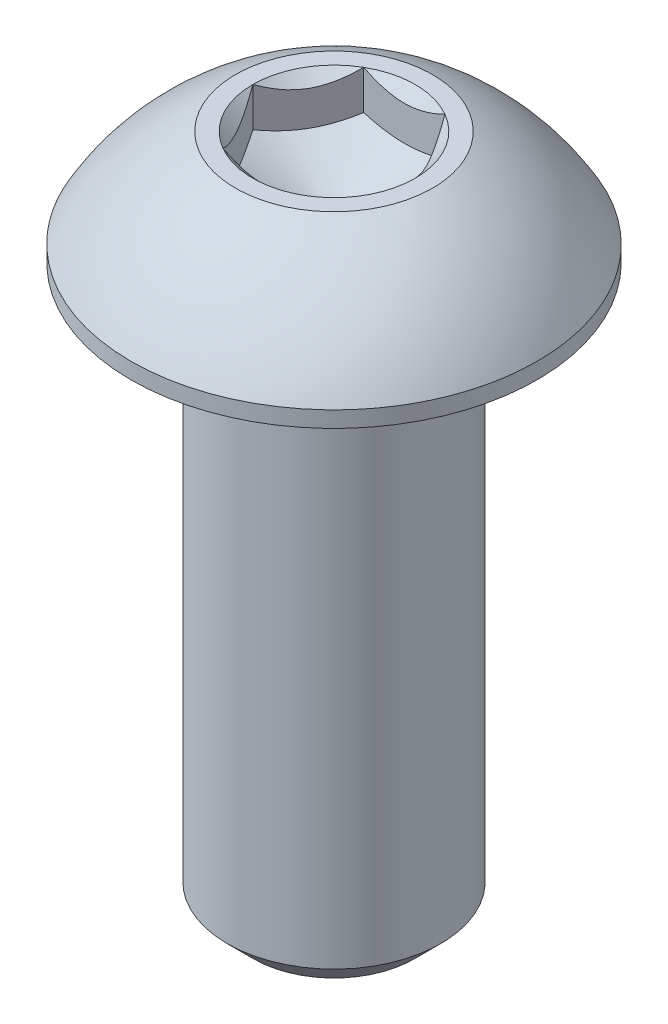
ISO-10303-21;
HEADER;
FILE_DESCRIPTION(('STEP AP214'),'2;1');
FILE_NAME('part.step','',(''),(''),'','','');
FILE_SCHEMA(('AUTOMOTIVE_DESIGN { 1 0 10303 214 1 1 1 1 }'));
ENDSEC;
DATA;
#1=APPLICATION_CONTEXT('core data for automotive mechanical design processes');
#2=APPLICATION_PROTOCOL_DEFINITION('international standard','automotive_design',2000,#1);
#3=PRODUCT_CONTEXT('',#1,'mechanical');
#4=PRODUCT('Part','Part','',(#3));
#5=PRODUCT_RELATED_PRODUCT_CATEGORY('part','',(#4));
#6=PRODUCT_DEFINITION_FORMATION('','',#4);
#7=PRODUCT_DEFINITION_CONTEXT('part definition',#1,'design');
#8=PRODUCT_DEFINITION('design','',#6,#7);
#9=PRODUCT_DEFINITION_SHAPE('','',#8);
#10=(LENGTH_UNIT() NAMED_UNIT(*) SI_UNIT(.MILLI.,.METRE.));
#11=(NAMED_UNIT(*) PLANE_ANGLE_UNIT() SI_UNIT($,.RADIAN.));
#12=(NAMED_UNIT(*) SI_UNIT($,.STERADIAN.) SOLID_ANGLE_UNIT());
#13=UNCERTAINTY_MEASURE_WITH_UNIT(LENGTH_MEASURE(1.E-05),#10,'distance_accuracy_value','');
#14=(GEOMETRIC_REPRESENTATION_CONTEXT(3) GLOBAL_UNCERTAINTY_ASSIGNED_CONTEXT((#13)) GLOBAL_UNIT_ASSIGNED_CONTEXT((#10,
#11,#12)) REPRESENTATION_CONTEXT('',''));
#15=CARTESIAN_POINT('',(0.,0.,0.));
#16=DIRECTION('',(0.,0.,1.));
#17=DIRECTION('',(1.,0.,0.));
#18=AXIS2_PLACEMENT_3D('',#15,#16,#17);
#19=CARTESIAN_POINT('',(0.,1.68698333328621,0.));
#20=DIRECTION('',(0.,1.,0.));
#21=DIRECTION('',(-1.,0.,0.));
#22=AXIS2_PLACEMENT_3D('',#19,#20,#21);
#23=CONICAL_SURFACE('',#22,1.84408562728322,1.04719755120045);
#24=CARTESIAN_POINT('',(0.,0.622299999974985,0.));
#25=VERTEX_POINT('',#24);
#26=VERTEX_LOOP('',#25);
#27=FACE_BOUND('',#26,.T.);
#28=CARTESIAN_POINT('',(1.83308710468165,1.68063333330156,7.94276010632228E-12));
#29=CARTESIAN_POINT('',(1.79281056633891,1.65737292224276,-0.0697610107546779));
#30=CARTESIAN_POINT('',(1.75218636149017,1.63621879574418,-0.140124197569787));
#31=CARTESIAN_POINT('',(1.67023457085926,1.59929490329089,-0.282068862713764));
#32=CARTESIAN_POINT('',(1.62890552942637,1.58353819818402,-0.353652862303655));
#33=CARTESIAN_POINT('',(1.54675961666491,1.55901175070747,-0.495933756840625));
#34=CARTESIAN_POINT('',(1.50595538099753,1.55007875220177,-0.566608766180528));
#35=CARTESIAN_POINT('',(1.42415501242217,1.53941661050333,-0.708291160630917));
#36=CARTESIAN_POINT('',(1.38315917663227,1.53767863601706,-0.779298031117773));
#37=CARTESIAN_POINT('',(1.30656285397213,1.5413034511771,-0.911966753638082));
#38=CARTESIAN_POINT('',(1.27095087320288,1.54577622879446,-0.973648513688575));
#39=CARTESIAN_POINT('',(1.19995891211689,1.55994944206934,-1.09661019721847));
#40=CARTESIAN_POINT('',(1.16457917715915,1.56965471453079,-1.15788969572359));
#41=CARTESIAN_POINT('',(1.09344096593547,1.59391601722574,-1.28110469192258));
#42=CARTESIAN_POINT('',(1.05769148862926,1.60857484155799,-1.34302460296097));
#43=CARTESIAN_POINT('',(0.986725583285904,1.64184417550588,-1.46594115662078));
#44=CARTESIAN_POINT('',(0.951508246794672,1.660446873169,-1.52693937273084));
#45=CARTESIAN_POINT('',(0.91654353567499,1.68063334291961,-1.5875000288621));
#46=B_SPLINE_CURVE_WITH_KNOTS('',3,(#28,#29,#30,#31,#32,#33,#34,#35,#36,#37,#38,#39,#40,#41,#42,
#43,#44,#45),.UNSPECIFIED.,.F.,.F.,(4,2,2,2,2,2,2,2,4),(0.,0.25163145920722,0.503867592337533,
0.749861662422156,0.995553705563786,1.20944306090894,1.42353047074415,1.64236531368521,
1.86077067615945),.UNSPECIFIED.);
#47=CARTESIAN_POINT('',(1.83308710467935,1.68063333330023,-3.97200432340522E-12));
#48=VERTEX_POINT('',#47);
#49=CARTESIAN_POINT('',(0.916543500689181,1.68063332560455,-1.58750001443105));
#50=VERTEX_POINT('',#49);
#51=EDGE_CURVE('E111',#48,#50,#46,.T.);
#52=ORIENTED_EDGE('',*,*,#51,.T.);
#53=CARTESIAN_POINT('',(0.916543465703373,1.68063330828949,-1.5875));
#54=CARTESIAN_POINT('',(0.841304335442012,1.65891136904666,-1.58749999999996));
#55=CARTESIAN_POINT('',(0.765469996919557,1.63902432100938,-1.58749999999998));
#56=CARTESIAN_POINT('',(0.612569443736088,1.60387643134396,-1.58750000000002));
#57=CARTESIAN_POINT('',(0.53550087134523,1.58862594056695,-1.58750000000004));
#58=CARTESIAN_POINT('',(0.382228504812052,1.56410130515335,-1.58749999999996));
#59=CARTESIAN_POINT('',(0.30604629018988,1.55469640544159,-1.58749999999987));
#60=CARTESIAN_POINT('',(0.153242338423504,1.54207088542383,-1.58750000000013));
#61=CARTESIAN_POINT('',(0.0766211692133859,1.53884355230366,-1.58750000000049));
#62=CARTESIAN_POINT('',(-0.0766211765422199,1.53884355230651,-1.58750000000049));
#63=CARTESIAN_POINT('',(-0.153242353087707,1.54207088604693,-1.58750000000013));
#64=CARTESIAN_POINT('',(-0.306046319402563,1.55469640844525,-1.58749999999987));
#65=CARTESIAN_POINT('',(-0.382228541237543,1.56410130992023,-1.58749999999996));
#66=CARTESIAN_POINT('',(-0.535500922320663,1.588625949812,-1.58750000000004));
#67=CARTESIAN_POINT('',(-0.612569502041049,1.60387644333815,-1.58750000000002));
#68=CARTESIAN_POINT('',(-0.765470069592637,1.63902433912291,-1.58749999999998));
#69=CARTESIAN_POINT('',(-0.841304415154823,1.65891139052621,-1.58749999999996));
#70=CARTESIAN_POINT('',(-0.916543552347703,1.68063333330156,-1.5875));
#71=B_SPLINE_CURVE_WITH_KNOTS('',3,(#53,#54,#55,#56,#57,#58,#59,#60,#61,#62,#63,#64,#65,#66,#67,
#68,#69,#70),.UNSPECIFIED.,.F.,.F.,(4,2,2,2,2,2,2,2,4),(0.,0.235008234984496,0.470537323953047,
0.700588176227614,0.93038890294962,1.16018965165212,1.39024052599311,1.62576963810153,
1.86077789603511),.UNSPECIFIED.);
#72=CARTESIAN_POINT('',(-0.916543552343117,1.68063333330023,-1.5875));
#73=VERTEX_POINT('',#72);
#74=EDGE_CURVE('E107',#50,#73,#71,.T.);
#75=ORIENTED_EDGE('',*,*,#74,.T.);
#76=CARTESIAN_POINT('',(-0.916543552333945,1.68063333330156,-1.58750000000794));
#77=CARTESIAN_POINT('',(-0.956820090671271,1.65737292224584,-1.5177389892547));
#78=CARTESIAN_POINT('',(-0.997444295514534,1.63621879574984,-1.44737580244908));
#79=CARTESIAN_POINT('',(-1.07939608613362,1.59929490330038,-1.30543113732557));
#80=CARTESIAN_POINT('',(-1.12072512756017,1.58353819819468,-1.23384713774668));
#81=CARTESIAN_POINT('',(-1.20287104032067,1.5590117507145,-1.09156624321137));
#82=CARTESIAN_POINT('',(-1.24367527599358,1.55007875220591,-1.02089123386187));
#83=CARTESIAN_POINT('',(-1.32547564458103,1.539416610504,-0.879208839390551));
#84=CARTESIAN_POINT('',(-1.36647148037747,1.53767863601724,-0.808201968892358));
#85=CARTESIAN_POINT('',(-1.44306780163656,1.54130345111013,-0.675533248798745));
#86=CARTESIAN_POINT('',(-1.47867978100122,1.54577622844007,-0.613851491181058));
#87=CARTESIAN_POINT('',(-1.5496717393014,1.55994944074467,-0.490889812476353));
#88=CARTESIAN_POINT('',(-1.58505147287795,1.56965471252234,-0.429610316363514));
#89=CARTESIAN_POINT('',(-1.65618968130729,1.59391601351232,-0.306395325004476));
#90=CARTESIAN_POINT('',(-1.69193915720172,1.60857483681103,-0.244475416411364));
#91=CARTESIAN_POINT('',(-1.76290505977286,1.64184416846707,-0.121558867553154));
#92=CARTESIAN_POINT('',(-1.79812239490349,1.66044686487324,-0.0605606537997263));
#93=CARTESIAN_POINT('',(-1.83308710468165,1.68063333330156,7.94280702249205E-12));
#94=B_SPLINE_CURVE_WITH_KNOTS('',3,(#76,#77,#78,#79,#80,#81,#82,#83,#84,#85,#86,#87,#88,#89,#90,
#91,#92,#93),.UNSPECIFIED.,.F.,.F.,(4,2,2,2,2,2,2,2,4),(0.,0.25163145917351,0.503867592265784,
0.749861662384702,0.995553705563769,1.20944305246948,1.42353045383403,1.64236528786455,
1.8607706414961),.UNSPECIFIED.);
#95=CARTESIAN_POINT('',(-1.83308710467935,1.68063333330023,3.97168329557327E-12));
#96=VERTEX_POINT('',#95);
#97=EDGE_CURVE('E88',#73,#96,#94,.T.);
#98=ORIENTED_EDGE('',*,*,#97,.T.);
#99=CARTESIAN_POINT('',(-1.83308710468165,1.68063333330156,-7.94272365368566E-12));
#100=CARTESIAN_POINT('',(-1.79281056634432,1.65737292224584,0.0697610107453017));
#101=CARTESIAN_POINT('',(-1.75218636150106,1.63621879574984,0.140124197550919));
#102=CARTESIAN_POINT('',(-1.67023457088197,1.59929490330038,0.282068862674426));
#103=CARTESIAN_POINT('',(-1.62890552945543,1.58353819819468,0.353652862253321));
#104=CARTESIAN_POINT('',(-1.54675961669492,1.5590117507145,0.495933756788634));
#105=CARTESIAN_POINT('',(-1.50595538102201,1.55007875220591,0.566608766138132));
#106=CARTESIAN_POINT('',(-1.42415501243456,1.539416610504,0.708291160609449));
#107=CARTESIAN_POINT('',(-1.38315917663812,1.53767863601724,0.779298031107642));
#108=CARTESIAN_POINT('',(-1.30656285537903,1.54130345111013,0.911966751201255));
#109=CARTESIAN_POINT('',(-1.27095087601437,1.54577622844007,0.973648508818941));
#110=CARTESIAN_POINT('',(-1.1999589177142,1.55994944074467,1.09661018752365));
#111=CARTESIAN_POINT('',(-1.16457918413765,1.56965471252234,1.15788968363649));
#112=CARTESIAN_POINT('',(-1.09344097570831,1.59391601351232,1.28110467499552));
#113=CARTESIAN_POINT('',(-1.05769149981388,1.60857483681103,1.34302458358864));
#114=CARTESIAN_POINT('',(-0.986725597242731,1.64184416846707,1.46594113244685));
#115=CARTESIAN_POINT('',(-0.951508262112103,1.66044686487324,1.52693934620027));
#116=CARTESIAN_POINT('',(-0.916543552333946,1.68063333330156,1.58750000000794));
#117=B_SPLINE_CURVE_WITH_KNOTS('',3,(#99,#100,#101,#102,#103,#104,#105,#106,#107,#108,#109,#110,
#111,#112,#113,#114,#115,#116),.UNSPECIFIED.,.F.,.F.,(4,2,2,2,2,2,2,2,4),(0.,0.25163145917351,
0.503867592265784,0.749861662384702,0.995553705563769,1.20944305246948,1.42353045383403,
1.64236528786455,1.8607706414961),.UNSPECIFIED.);
#118=CARTESIAN_POINT('',(-0.916543552340825,1.68063333330156,1.58750000000397));
#119=VERTEX_POINT('',#118);
#120=EDGE_CURVE('E85',#96,#119,#117,.T.);
#121=ORIENTED_EDGE('',*,*,#120,.T.);
#122=CARTESIAN_POINT('',(-0.916543552347703,1.68063333330156,1.5875));
#123=CARTESIAN_POINT('',(-0.841304415129728,1.658911390519,1.58750000000013));
#124=CARTESIAN_POINT('',(-0.765470069542191,1.6390243391097,1.58750000000006));
#125=CARTESIAN_POINT('',(-0.612569501934773,1.60387644331534,1.58749999999993));
#126=CARTESIAN_POINT('',(-0.535500922183844,1.58862594978587,1.58749999999987));
#127=CARTESIAN_POINT('',(-0.382228541095324,1.56410130990161,1.58750000000013));
#128=CARTESIAN_POINT('',(-0.306046319286171,1.55469640843333,1.58750000000044));
#129=CARTESIAN_POINT('',(-0.153242353028406,1.54207088604434,1.58749999999956));
#130=CARTESIAN_POINT('',(-0.0766211765142031,1.5388435523063,1.58749999999838));
#131=CARTESIAN_POINT('',(0.0766211765142028,1.5388435523063,1.58749999999838));
#132=CARTESIAN_POINT('',(0.153242353028406,1.54207088604434,1.58749999999956));
#133=CARTESIAN_POINT('',(0.30604631928617,1.55469640843333,1.58750000000044));
#134=CARTESIAN_POINT('',(0.382228541095323,1.56410130990161,1.58750000000013));
#135=CARTESIAN_POINT('',(0.535500922183843,1.58862594978587,1.58749999999987));
#136=CARTESIAN_POINT('',(0.612569501934772,1.60387644331534,1.58749999999993));
#137=CARTESIAN_POINT('',(0.76547006954219,1.6390243391097,1.58750000000006));
#138=CARTESIAN_POINT('',(0.841304415129726,1.658911390519,1.58750000000013));
#139=CARTESIAN_POINT('',(0.916543552347702,1.68063333330156,1.5875));
#140=B_SPLINE_CURVE_WITH_KNOTS('',3,(#122,#123,#124,#125,#126,#127,#128,#129,#130,#131,#132,
#133,#134,#135,#136,#137,#138,#139),.UNSPECIFIED.,.F.,.F.,(4,2,2,2,2,2,2,2,4),(0.,
0.235008258011669,0.470537370211884,0.700588244472678,0.930388993085473,1.16018974169827,
1.39024061595906,1.62576972815928,1.86077798617094),.UNSPECIFIED.);
#141=CARTESIAN_POINT('',(0.916543552343116,1.68063333330023,1.5875));
#142=VERTEX_POINT('',#141);
#143=EDGE_CURVE('E20',#119,#142,#140,.T.);
#144=ORIENTED_EDGE('',*,*,#143,.T.);
#145=CARTESIAN_POINT('',(0.916543552333945,1.68063333330156,1.58750000000794));
#146=CARTESIAN_POINT('',(0.956820090671271,1.65737292224584,1.5177389892547));
#147=CARTESIAN_POINT('',(0.997444295514534,1.63621879574984,1.44737580244908));
#148=CARTESIAN_POINT('',(1.07939608613362,1.59929490330038,1.30543113732557));
#149=CARTESIAN_POINT('',(1.12072512756017,1.58353819819468,1.23384713774668));
#150=CARTESIAN_POINT('',(1.20287104032067,1.5590117507145,1.09156624321137));
#151=CARTESIAN_POINT('',(1.24367527599358,1.55007875220591,1.02089123386187));
#152=CARTESIAN_POINT('',(1.32547564458103,1.539416610504,0.879208839390551));
#153=CARTESIAN_POINT('',(1.36647148037747,1.53767863601724,0.808201968892358));
#154=CARTESIAN_POINT('',(1.44306780163656,1.54130345111013,0.675533248798746));
#155=CARTESIAN_POINT('',(1.47867978100122,1.54577622844007,0.613851491181059));
#156=CARTESIAN_POINT('',(1.54967173930139,1.55994944074467,0.490889812476353));
#157=CARTESIAN_POINT('',(1.58505147287795,1.56965471252234,0.429610316363515));
#158=CARTESIAN_POINT('',(1.65618968130728,1.59391601351232,0.306395325004476));
#159=CARTESIAN_POINT('',(1.69193915720172,1.60857483681103,0.244475416411364));
#160=CARTESIAN_POINT('',(1.76290505977286,1.64184416846707,0.121558867553154));
#161=CARTESIAN_POINT('',(1.79812239490349,1.66044686487324,0.0605606537997262));
#162=CARTESIAN_POINT('',(1.83308710468165,1.68063333330156,-7.94295499227587E-12));
#163=B_SPLINE_CURVE_WITH_KNOTS('',3,(#145,#146,#147,#148,#149,#150,#151,#152,#153,#154,#155,
#156,#157,#158,#159,#160,#161,#162),.UNSPECIFIED.,.F.,.F.,(4,2,2,2,2,2,2,2,4),(0.,
0.25163145917351,0.503867592265784,0.749861662384701,0.995553705563769,1.20944305246948,
1.42353045383403,1.64236528786455,1.8607706414961),.UNSPECIFIED.);
#164=EDGE_CURVE('E83',#142,#48,#163,.T.);
#165=ORIENTED_EDGE('',*,*,#164,.T.);
#166=EDGE_LOOP('',(#52,#75,#98,#121,#144,#165));
#167=FACE_BOUND('',#166,.T.);
#168=ADVANCED_FACE('F16',(#27,#167),#23,.F.);
#169=CARTESIAN_POINT('',(2.2225,-12.701,1.5875));
#170=DIRECTION('',(0.,0.,1.));
#171=DIRECTION('',(1.,0.,0.));
#172=AXIS2_PLACEMENT_3D('',#169,#170,#171);
#173=PLANE('',#172);
#174=DIRECTION('',(0.,1.,0.));
#175=VECTOR('',#174,1.);
#176=CARTESIAN_POINT('',(-0.916543552338532,-12.701,1.5875));
#177=LINE('',#176,#175);
#178=CARTESIAN_POINT('',(-0.916543552351339,2.56539999995478,1.58750000002218));
#179=VERTEX_POINT('',#178);
#180=EDGE_CURVE('E77',#119,#179,#177,.T.);
#181=ORIENTED_EDGE('',*,*,#180,.T.);
#182=CARTESIAN_POINT('',(-0.916543552371599,2.56539999994792,1.58749999999595));
#183=CARTESIAN_POINT('',(-0.853951042769138,2.53413294688092,1.58749999999871));
#184=CARTESIAN_POINT('',(-0.790318655200357,2.50469158145599,1.58749999999969));
#185=CARTESIAN_POINT('',(-0.660541633671972,2.4507249639758,1.58750000000031));
#186=CARTESIAN_POINT('',(-0.594383506081024,2.42623244845778,1.58749999999993));
#187=CARTESIAN_POINT('',(-0.46015516772024,2.38393913822606,1.58750000000006));
#188=CARTESIAN_POINT('',(-0.392092287378396,2.36611569660322,1.58750000000057));
#189=CARTESIAN_POINT('',(-0.254474473006279,2.33867573772343,1.58749999999944));
#190=CARTESIAN_POINT('',(-0.18492484409195,2.32903384177503,1.58749999999781));
#191=CARTESIAN_POINT('',(-0.0959348173078032,2.32259288204442,1.5875000000006));
#192=CARTESIAN_POINT('',(-0.0767574755229647,2.32155158039156,1.58750000000149));
#193=CARTESIAN_POINT('',(-0.0383876515925966,2.32016146096835,1.58749999999851));
#194=CARTESIAN_POINT('',(-0.019195183346946,2.31981226702045,1.58749999999465));
#195=CARTESIAN_POINT('',(0.0481761373889916,2.31981447200048,1.58749999998834));
#196=CARTESIAN_POINT('',(0.0963693775090954,2.3220196183287,1.58749999999681));
#197=CARTESIAN_POINT('',(0.192379976760513,2.33070924092509,1.5875000000032));
#198=CARTESIAN_POINT('',(0.240197050167982,2.33719670192335,1.58750000000111));
#199=CARTESIAN_POINT('',(0.383011002180955,2.36267698349897,1.58749999999777));
#200=CARTESIAN_POINT('',(0.476967063072048,2.38768338081294,1.58749999999948));
#201=CARTESIAN_POINT('',(0.628737189879038,2.4388400286602,1.58750000000034));
#202=CARTESIAN_POINT('',(0.687787687838377,2.46158766208048,1.58750000000017));
#203=CARTESIAN_POINT('',(0.803652764135095,2.51088912316105,1.58749999999983));
#204=CARTESIAN_POINT('',(0.860482853254814,2.53740623437023,1.58749999999967));
#205=CARTESIAN_POINT('',(0.916543552372238,2.56539999994602,1.5875));
#206=B_SPLINE_CURVE_WITH_KNOTS('',3,(#182,#183,#184,#185,#186,#187,#188,#189,#190,#191,#192,
#193,#194,#195,#196,#197,#198,#199,#200,#201,#202,#203,#204,#205),.UNSPECIFIED.,.F.,.F.,(4,2,2,
2,2,2,2,2,2,2,2,4),(0.,0.210047204145353,0.421441388628532,0.63211105945904,0.842124830805997,
0.899732953428039,0.957309756023073,1.10181621381984,1.2464234976589,1.53683268065851,
1.72655304073689,1.91453812068994),.UNSPECIFIED.);
#207=CARTESIAN_POINT('',(0.916543552329892,2.56539999996327,1.58750000004437));
#208=VERTEX_POINT('',#207);
#209=EDGE_CURVE('E98',#179,#208,#206,.T.);
#210=ORIENTED_EDGE('',*,*,#209,.T.);
#211=DIRECTION('',(0.,1.,0.));
#212=VECTOR('',#211,1.);
#213=CARTESIAN_POINT('',(0.91654355233853,-12.701,1.5875));
#214=LINE('',#213,#212);
#215=EDGE_CURVE('E80',#208,#142,#214,.F.);
#216=ORIENTED_EDGE('',*,*,#215,.T.);
#217=ORIENTED_EDGE('',*,*,#143,.F.);
#218=EDGE_LOOP('',(#181,#210,#216,#217));
#219=FACE_BOUND('',#218,.T.);
#220=ADVANCED_FACE('F75',(#219),#173,.F.);
#221=CARTESIAN_POINT('',(1.9304403285078,-12.701,-0.168620729955457));
#222=DIRECTION('',(0.866025403784438,0.,0.500000000000001));
#223=DIRECTION('',(0.500000000000001,0.,-0.866025403784438));
#224=AXIS2_PLACEMENT_3D('',#221,#222,#223);
#225=PLANE('',#224);
#226=CARTESIAN_POINT('',(0.916543552318486,2.56539999994792,1.58750000002661));
#227=CARTESIAN_POINT('',(0.948045601819501,2.53392818230274,1.53293684975349));
#228=CARTESIAN_POINT('',(0.980074366265609,2.50430506272304,1.47746140243131));
#229=CARTESIAN_POINT('',(1.04538430383377,2.45006639539546,1.36434127232568));
#230=CARTESIAN_POINT('',(1.07867168454047,2.42548101616301,1.30668583769021));
#231=CARTESIAN_POINT('',(1.14579405489387,2.38336609605498,1.19042648191324));
#232=CARTESIAN_POINT('',(1.17961195971128,2.36573072948727,1.13185215256412));
#233=CARTESIAN_POINT('',(1.24799206394659,2.33856008862283,1.0134143378018));
#234=CARTESIAN_POINT('',(1.28255217595178,2.32900454007232,0.953554467893514));
#235=CARTESIAN_POINT('',(1.34211812032325,2.32038274183861,0.850383225841286));
#236=CARTESIAN_POINT('',(1.36704705311503,2.31910682172834,0.807205047667461));
#237=CARTESIAN_POINT('',(1.41686413306601,2.32125913780747,0.720919334107648));
#238=CARTESIAN_POINT('',(1.44175226286874,2.32468902284558,0.677811828783944));
#239=CARTESIAN_POINT('',(1.4912872005843,2.33605631415955,0.592014799910837));
#240=CARTESIAN_POINT('',(1.51593378092209,2.34399762019379,0.549325670532947));
#241=CARTESIAN_POINT('',(1.56481324859064,2.36395627681975,0.464663949084111));
#242=CARTESIAN_POINT('',(1.58904595372821,2.37597537628452,0.422691672580996));
#243=CARTESIAN_POINT('',(1.65109202753264,2.41164383188021,0.315224720341557));
#244=CARTESIAN_POINT('',(1.68852122777912,2.43797770752904,0.250395443827986));
#245=CARTESIAN_POINT('',(1.74355675432914,2.48243061453382,0.155071115622044));
#246=CARTESIAN_POINT('',(1.76169266898351,2.49804835924841,0.12365878999894));
#247=CARTESIAN_POINT('',(1.79763114850234,2.53070945052044,0.0614115175255607));
#248=CARTESIAN_POINT('',(1.81543386710544,2.54775211871956,0.0305763043921381));
#249=CARTESIAN_POINT('',(1.83308710469388,2.56539999994598,-2.91208576452051E-11));
#250=B_SPLINE_CURVE_WITH_KNOTS('',3,(#226,#227,#228,#229,#230,#231,#232,#233,#234,#235,#236,
#237,#238,#239,#240,#241,#242,#243,#244,#245,#246,#247,#248,#249),.UNSPECIFIED.,.F.,.F.,(4,2,2,
2,2,2,2,2,2,2,2,4),(0.,0.211427927736714,0.424087197157576,0.633370156436503,0.842126401534482,
0.991537201117911,1.14100036554024,1.29059292579279,1.44024972417007,1.677817214201,
1.79627069414707,1.91466809999466),.UNSPECIFIED.);
#251=CARTESIAN_POINT('',(1.83308710471117,2.56539999996327,2.96630611256474E-11));
#252=VERTEX_POINT('',#251);
#253=EDGE_CURVE('E350',#208,#252,#250,.T.);
#254=ORIENTED_EDGE('',*,*,#253,.T.);
#255=DIRECTION('',(0.,1.,0.));
#256=VECTOR('',#255,1.);
#257=CARTESIAN_POINT('',(1.83308710467706,-12.701,0.));
#258=LINE('',#257,#256);
#259=EDGE_CURVE('E108',#252,#48,#258,.F.);
#260=ORIENTED_EDGE('',*,*,#259,.T.);
#261=ORIENTED_EDGE('',*,*,#164,.F.);
#262=ORIENTED_EDGE('',*,*,#215,.F.);
#263=EDGE_LOOP('',(#254,#260,#261,#262));
#264=FACE_BOUND('',#263,.T.);
#265=ADVANCED_FACE('F304',(#264),#225,.F.);
#266=CARTESIAN_POINT('',(1.9304403285078,-12.701,0.168620729955457));
#267=DIRECTION('',(0.866025403784439,0.,-0.5));
#268=DIRECTION('',(-0.5,0.,-0.866025403784439));
#269=AXIS2_PLACEMENT_3D('',#266,#267,#268);
#270=PLANE('',#269);
#271=CARTESIAN_POINT('',(1.83308710469009,2.56539999994792,3.06623994962789E-11));
#272=CARTESIAN_POINT('',(1.80158505519356,2.53392818230274,-0.0545631502450498));
#273=CARTESIAN_POINT('',(1.7695562907493,2.50430506272304,-0.110038597568298));
#274=CARTESIAN_POINT('',(1.70424635318251,2.45006639539546,-0.223158727674711));
#275=CARTESIAN_POINT('',(1.67095897247531,2.42548101616301,-0.280814162309892));
#276=CARTESIAN_POINT('',(1.60383660212154,2.38336609605498,-0.397073518086656));
#277=CARTESIAN_POINT('',(1.57001869730427,2.36573072948727,-0.455647847435853));
#278=CARTESIAN_POINT('',(1.50163859306904,2.33856008862283,-0.574085662198224));
#279=CARTESIAN_POINT('',(1.46707848106383,2.32900454007232,-0.633945532106493));
#280=CARTESIAN_POINT('',(1.40751253669234,2.32038274183861,-0.737116774158711));
#281=CARTESIAN_POINT('',(1.38258360390056,2.31910682172834,-0.780294952332539));
#282=CARTESIAN_POINT('',(1.33276652394959,2.32125913780747,-0.866580665892355));
#283=CARTESIAN_POINT('',(1.30787839414685,2.32468902284558,-0.909688171216057));
#284=CARTESIAN_POINT('',(1.2583434564313,2.33605631415955,-0.995485200089164));
#285=CARTESIAN_POINT('',(1.2336968760935,2.34399762019379,-1.03817432946705));
#286=CARTESIAN_POINT('',(1.18481740842496,2.36395627681975,-1.12283605091589));
#287=CARTESIAN_POINT('',(1.16058470328738,2.37597537628452,-1.16480832741901));
#288=CARTESIAN_POINT('',(1.09853862948295,2.41164383188021,-1.27227527965844));
#289=CARTESIAN_POINT('',(1.06110942923647,2.43797770752904,-1.33710455617201));
#290=CARTESIAN_POINT('',(1.00607390268645,2.48243061453382,-1.43242888437796));
#291=CARTESIAN_POINT('',(0.987937988032083,2.49804835924841,-1.46384121000106));
#292=CARTESIAN_POINT('',(0.951999508513258,2.53070945052044,-1.52608848247444));
#293=CARTESIAN_POINT('',(0.934196789910157,2.54775211871956,-1.55692369560786));
#294=CARTESIAN_POINT('',(0.916543552321719,2.56539999994598,-1.58750000002912));
#295=B_SPLINE_CURVE_WITH_KNOTS('',3,(#271,#272,#273,#274,#275,#276,#277,#278,#279,#280,#281,
#282,#283,#284,#285,#286,#287,#288,#289,#290,#291,#292,#293,#294),.UNSPECIFIED.,.F.,.F.,(4,2,2,
2,2,2,2,2,2,2,2,4),(0.,0.211427927736714,0.424087197157575,0.633370156436502,0.842126401534481,
0.991537201117911,1.14100036554024,1.29059292579279,1.44024972417007,1.67781721420099,
1.79627069414706,1.91466809999466),.UNSPECIFIED.);
#296=CARTESIAN_POINT('',(0.916543552381274,2.56539999996327,-1.5875000000147));
#297=VERTEX_POINT('',#296);
#298=EDGE_CURVE('E389',#252,#297,#295,.T.);
#299=ORIENTED_EDGE('',*,*,#298,.T.);
#300=DIRECTION('',(0.,1.,0.));
#301=VECTOR('',#300,1.);
#302=CARTESIAN_POINT('',(0.91654355233853,-12.701,-1.5875));
#303=LINE('',#302,#301);
#304=EDGE_CURVE('E104',#297,#50,#303,.F.);
#305=ORIENTED_EDGE('',*,*,#304,.T.);
#306=ORIENTED_EDGE('',*,*,#51,.F.);
#307=ORIENTED_EDGE('',*,*,#259,.F.);
#308=EDGE_LOOP('',(#299,#305,#306,#307));
#309=FACE_BOUND('',#308,.T.);
#310=ADVANCED_FACE('F294',(#309),#270,.F.);
#311=CARTESIAN_POINT('',(2.2225,-12.701,-1.5875));
#312=DIRECTION('',(0.,0.,-1.));
#313=DIRECTION('',(-1.,0.,0.));
#314=AXIS2_PLACEMENT_3D('',#311,#312,#313);
#315=PLANE('',#314);
#316=CARTESIAN_POINT('',(0.916543552371598,2.56539999994792,-1.58749999999595));
#317=CARTESIAN_POINT('',(0.853539453386572,2.53392818230177,-1.58749999999854));
#318=CARTESIAN_POINT('',(0.789481924508789,2.50430506272058,-1.58749999999961));
#319=CARTESIAN_POINT('',(0.658862049398995,2.45006639538863,-1.58750000000039));
#320=CARTESIAN_POINT('',(0.592287287997667,2.42548101615331,-1.5875000000001));
#321=CARTESIAN_POINT('',(0.458042547314971,2.38336609603783,-1.5874999999999));
#322=CARTESIAN_POINT('',(0.390406737692196,2.36573072946559,-1.58749999999997));
#323=CARTESIAN_POINT('',(0.253646529244852,2.33856008859053,-1.58750000000003));
#324=CARTESIAN_POINT('',(0.184526305245745,2.32900454003392,-1.58750000000001));
#325=CARTESIAN_POINT('',(0.0653944165289689,2.32038274178937,-1.5875));
#326=CARTESIAN_POINT('',(0.01553655096057,2.3191068216739,-1.5875));
#327=CARTESIAN_POINT('',(-0.0840976089116431,2.32125913774098,-1.5875));
#328=CARTESIAN_POINT('',(-0.133873868502521,2.32468902277222,-1.5875));
#329=CARTESIAN_POINT('',(-0.232943743905129,2.33605631407124,-1.5875));
#330=CARTESIAN_POINT('',(-0.282236904566799,2.3439976200974,-1.5875));
#331=CARTESIAN_POINT('',(-0.379995839876662,2.36395627670648,-1.5875));
#332=CARTESIAN_POINT('',(-0.428461250138508,2.37597537616245,-1.5875));
#333=CARTESIAN_POINT('',(-0.552553397791376,2.41164383175733,-1.5875));
#334=CARTESIAN_POINT('',(-0.62741179833943,2.43797770742303,-1.5875));
#335=CARTESIAN_POINT('',(-0.737482851518326,2.48243061446185,-1.5875));
#336=CARTESIAN_POINT('',(-0.773754680852804,2.49804835918928,-1.5875));
#337=CARTESIAN_POINT('',(-0.845631639940652,2.5307094504893,-1.5875));
#338=CARTESIAN_POINT('',(-0.881237077171317,2.54775211870354,-1.5875));
#339=CARTESIAN_POINT('',(-0.916543552372156,2.56539999994598,-1.5875));
#340=B_SPLINE_CURVE_WITH_KNOTS('',3,(#316,#317,#318,#319,#320,#321,#322,#323,#324,#325,#326,
#327,#328,#329,#330,#331,#332,#333,#334,#335,#336,#337,#338,#339),.UNSPECIFIED.,.F.,.F.,(4,2,2,
2,2,2,2,2,2,2,2,4),(0.,0.211427927704404,0.424087197092948,0.633370156340855,0.842126401407839,
0.991537200946326,1.14100036532366,1.29059292553115,1.44024972386336,1.67781721406542,
1.7962706940976,1.91466810003093),.UNSPECIFIED.);
#341=CARTESIAN_POINT('',(-0.916543552329894,2.56539999996327,-1.58750000004437));
#342=VERTEX_POINT('',#341);
#343=EDGE_CURVE('E384',#297,#342,#340,.T.);
#344=ORIENTED_EDGE('',*,*,#343,.T.);
#345=DIRECTION('',(0.,1.,0.));
#346=VECTOR('',#345,1.);
#347=CARTESIAN_POINT('',(-0.916543552338531,-12.701,-1.5875));
#348=LINE('',#347,#346);
#349=EDGE_CURVE('E90',#342,#73,#348,.F.);
#350=ORIENTED_EDGE('',*,*,#349,.T.);
#351=ORIENTED_EDGE('',*,*,#74,.F.);
#352=ORIENTED_EDGE('',*,*,#304,.F.);
#353=EDGE_LOOP('',(#344,#350,#351,#352));
#354=FACE_BOUND('',#353,.T.);
#355=ADVANCED_FACE('F285',(#354),#315,.F.);
#356=CARTESIAN_POINT('',(-0.819190328507796,-12.701,-1.75612072995546));
#357=DIRECTION('',(-0.866025403784439,0.,-0.5));
#358=DIRECTION('',(-0.5,0.,0.866025403784439));
#359=AXIS2_PLACEMENT_3D('',#356,#357,#358);
#360=PLANE('',#359);
#361=CARTESIAN_POINT('',(-0.916543552318488,2.56539999994792,-1.58750000002661));
#362=CARTESIAN_POINT('',(-0.948045601819502,2.53392818230274,-1.53293684975349));
#363=CARTESIAN_POINT('',(-0.98007436626561,2.50430506272304,-1.47746140243131));
#364=CARTESIAN_POINT('',(-1.04538430383377,2.45006639539546,-1.36434127232568));
#365=CARTESIAN_POINT('',(-1.07867168454047,2.42548101616301,-1.30668583769021));
#366=CARTESIAN_POINT('',(-1.14579405489387,2.38336609605498,-1.19042648191324));
#367=CARTESIAN_POINT('',(-1.17961195971128,2.36573072948727,-1.13185215256412));
#368=CARTESIAN_POINT('',(-1.2479920639466,2.33856008862283,-1.0134143378018));
#369=CARTESIAN_POINT('',(-1.28255217595178,2.32900454007232,-0.953554467893514));
#370=CARTESIAN_POINT('',(-1.34211812032325,2.32038274183861,-0.850383225841286));
#371=CARTESIAN_POINT('',(-1.36704705311503,2.31910682172834,-0.807205047667461));
#372=CARTESIAN_POINT('',(-1.41686413306601,2.32125913780747,-0.720919334107648));
#373=CARTESIAN_POINT('',(-1.44175226286874,2.32468902284558,-0.677811828783944));
#374=CARTESIAN_POINT('',(-1.4912872005843,2.33605631415955,-0.592014799910837));
#375=CARTESIAN_POINT('',(-1.51593378092209,2.34399762019379,-0.549325670532947));
#376=CARTESIAN_POINT('',(-1.56481324859064,2.36395627681975,-0.464663949084111));
#377=CARTESIAN_POINT('',(-1.58904595372821,2.37597537628452,-0.422691672580996));
#378=CARTESIAN_POINT('',(-1.65109202753264,2.41164383188021,-0.315224720341556));
#379=CARTESIAN_POINT('',(-1.68852122777912,2.43797770752904,-0.250395443827986));
#380=CARTESIAN_POINT('',(-1.74355675432914,2.48243061453381,-0.155071115622044));
#381=CARTESIAN_POINT('',(-1.76169266898351,2.4980483592484,-0.123658789998941));
#382=CARTESIAN_POINT('',(-1.79763114850234,2.53070945052044,-0.0614115175255615));
#383=CARTESIAN_POINT('',(-1.81543386710544,2.54775211871956,-0.030576304392139));
#384=CARTESIAN_POINT('',(-1.83308710469387,2.56539999994598,2.91200867962029E-11));
#385=B_SPLINE_CURVE_WITH_KNOTS('',3,(#361,#362,#363,#364,#365,#366,#367,#368,#369,#370,#371,
#372,#373,#374,#375,#376,#377,#378,#379,#380,#381,#382,#383,#384),.UNSPECIFIED.,.F.,.F.,(4,2,2,
2,2,2,2,2,2,2,2,4),(0.,0.211427927736714,0.424087197157576,0.633370156436502,0.842126401534481,
0.991537201117911,1.14100036554024,1.29059292579279,1.44024972417007,1.67781721420099,
1.79627069414707,1.91466809999466),.UNSPECIFIED.);
#386=CARTESIAN_POINT('',(-1.83308710471117,2.56539999996327,-2.96637551218256E-11));
#387=VERTEX_POINT('',#386);
#388=EDGE_CURVE('E39',#342,#387,#385,.T.);
#389=ORIENTED_EDGE('',*,*,#388,.T.);
#390=DIRECTION('',(0.,1.,0.));
#391=VECTOR('',#390,1.);
#392=CARTESIAN_POINT('',(-1.83308710467706,-12.701,0.));
#393=LINE('',#392,#391);
#394=EDGE_CURVE('E96',#387,#96,#393,.F.);
#395=ORIENTED_EDGE('',*,*,#394,.T.);
#396=ORIENTED_EDGE('',*,*,#97,.F.);
#397=ORIENTED_EDGE('',*,*,#349,.F.);
#398=EDGE_LOOP('',(#389,#395,#396,#397));
#399=FACE_BOUND('',#398,.T.);
#400=ADVANCED_FACE('F276',(#399),#360,.F.);
#401=CARTESIAN_POINT('',(-0.819190328507797,-12.701,1.75612072995546));
#402=DIRECTION('',(-0.866025403784439,0.,0.5));
#403=DIRECTION('',(0.5,0.,0.866025403784439));
#404=AXIS2_PLACEMENT_3D('',#401,#402,#403);
#405=PLANE('',#404);
#406=CARTESIAN_POINT('',(-1.83308710469009,2.56539999994792,-3.0663067870904E-11));
#407=CARTESIAN_POINT('',(-1.80158505519356,2.53392818230274,0.0545631502450492));
#408=CARTESIAN_POINT('',(-1.7695562907493,2.50430506272304,0.110038597568297));
#409=CARTESIAN_POINT('',(-1.70424635318251,2.45006639539546,0.22315872767471));
#410=CARTESIAN_POINT('',(-1.67095897247531,2.42548101616301,0.280814162309891));
#411=CARTESIAN_POINT('',(-1.60383660212154,2.38336609605498,0.397073518086656));
#412=CARTESIAN_POINT('',(-1.57001869730427,2.36573072948727,0.455647847435853));
#413=CARTESIAN_POINT('',(-1.50163859306905,2.33856008862283,0.574085662198223));
#414=CARTESIAN_POINT('',(-1.46707848106383,2.32900454007232,0.633945532106493));
#415=CARTESIAN_POINT('',(-1.40751253669234,2.32038274183861,0.73711677415871));
#416=CARTESIAN_POINT('',(-1.38258360390056,2.31910682172834,0.780294952332538));
#417=CARTESIAN_POINT('',(-1.33276652394959,2.32125913780747,0.866580665892354));
#418=CARTESIAN_POINT('',(-1.30787839414685,2.32468902284558,0.909688171216057));
#419=CARTESIAN_POINT('',(-1.2583434564313,2.33605631415955,0.995485200089163));
#420=CARTESIAN_POINT('',(-1.2336968760935,2.34399762019379,1.03817432946705));
#421=CARTESIAN_POINT('',(-1.18481740842496,2.36395627681975,1.12283605091589));
#422=CARTESIAN_POINT('',(-1.16058470328738,2.37597537628452,1.164808327419));
#423=CARTESIAN_POINT('',(-1.09853862948295,2.41164383188021,1.27227527965844));
#424=CARTESIAN_POINT('',(-1.06110942923647,2.43797770752904,1.33710455617201));
#425=CARTESIAN_POINT('',(-1.00607390268645,2.48243061453381,1.43242888437796));
#426=CARTESIAN_POINT('',(-0.987937988032083,2.4980483592484,1.46384121000106));
#427=CARTESIAN_POINT('',(-0.951999508513258,2.53070945052044,1.52608848247444));
#428=CARTESIAN_POINT('',(-0.934196789910157,2.54775211871956,1.55692369560786));
#429=CARTESIAN_POINT('',(-0.916543552321719,2.56539999994598,1.58750000002912));
#430=B_SPLINE_CURVE_WITH_KNOTS('',3,(#406,#407,#408,#409,#410,#411,#412,#413,#414,#415,#416,
#417,#418,#419,#420,#421,#422,#423,#424,#425,#426,#427,#428,#429),.UNSPECIFIED.,.F.,.F.,(4,2,2,
2,2,2,2,2,2,2,2,4),(0.,0.211427927736714,0.424087197157576,0.633370156436502,0.842126401534481,
0.99153720111791,1.14100036554024,1.29059292579279,1.44024972417007,1.67781721420099,
1.79627069414706,1.91466809999466),.UNSPECIFIED.);
#431=EDGE_CURVE('E94',#387,#179,#430,.T.);
#432=ORIENTED_EDGE('',*,*,#431,.T.);
#433=ORIENTED_EDGE('',*,*,#180,.F.);
#434=ORIENTED_EDGE('',*,*,#120,.F.);
#435=ORIENTED_EDGE('',*,*,#394,.F.);
#436=EDGE_LOOP('',(#432,#433,#434,#435));
#437=FACE_BOUND('',#436,.T.);
#438=ADVANCED_FACE('F92',(#437),#405,.F.);
#439=CARTESIAN_POINT('',(0.,2.5653999999804,0.));
#440=DIRECTION('',(0.,1.,0.));
#441=DIRECTION('',(0.,0.,1.));
#442=AXIS2_PLACEMENT_3D('',#439,#440,#441);
#443=CONICAL_SURFACE('',#442,1.83308710472829,0.785398163397448);
#444=ORIENTED_EDGE('',*,*,#209,.F.);
#445=CARTESIAN_POINT('',(0.,2.5653999999804,0.));
#446=DIRECTION('',(0.,1.,0.));
#447=DIRECTION('',(0.,0.,1.));
#448=AXIS2_PLACEMENT_3D('',#445,#446,#447);
#449=CIRCLE('',#448,1.83308710472829);
#450=EDGE_CURVE('E373',#179,#208,#449,.T.);
#451=ORIENTED_EDGE('',*,*,#450,.T.);
#452=EDGE_LOOP('',(#444,#451));
#453=FACE_BOUND('',#452,.T.);
#454=ADVANCED_FACE('F257',(#453),#443,.F.);
#455=CARTESIAN_POINT('',(0.,2.5653999999804,0.));
#456=DIRECTION('',(0.,1.,0.));
#457=DIRECTION('',(0.,0.,1.));
#458=AXIS2_PLACEMENT_3D('',#455,#456,#457);
#459=CONICAL_SURFACE('',#458,1.83308710472829,0.785398163512374);
#460=CARTESIAN_POINT('',(0.,2.5653999999804,0.));
#461=DIRECTION('',(0.,1.,0.));
#462=DIRECTION('',(0.,0.,1.));
#463=AXIS2_PLACEMENT_3D('',#460,#461,#462);
#464=CIRCLE('',#463,1.83308710472829);
#465=EDGE_CURVE('E430',#208,#252,#464,.T.);
#466=ORIENTED_EDGE('',*,*,#465,.T.);
#467=ORIENTED_EDGE('',*,*,#253,.F.);
#468=EDGE_LOOP('',(#466,#467));
#469=FACE_BOUND('',#468,.T.);
#470=ADVANCED_FACE('F247',(#469),#459,.F.);
#471=CARTESIAN_POINT('',(0.,2.5653999999804,0.));
#472=DIRECTION('',(0.,1.,0.));
#473=DIRECTION('',(0.,0.,1.));
#474=AXIS2_PLACEMENT_3D('',#471,#472,#473);
#475=CONICAL_SURFACE('',#474,1.83308710472829,0.785398163512374);
#476=CARTESIAN_POINT('',(0.,2.5653999999804,0.));
#477=DIRECTION('',(0.,1.,0.));
#478=DIRECTION('',(0.,0.,1.));
#479=AXIS2_PLACEMENT_3D('',#476,#477,#478);
#480=CIRCLE('',#479,1.83308710472829);
#481=EDGE_CURVE('E425',#252,#297,#480,.T.);
#482=ORIENTED_EDGE('',*,*,#481,.T.);
#483=ORIENTED_EDGE('',*,*,#298,.F.);
#484=EDGE_LOOP('',(#482,#483));
#485=FACE_BOUND('',#484,.T.);
#486=ADVANCED_FACE('F237',(#485),#475,.F.);
#487=CARTESIAN_POINT('',(0.,2.5653999999804,0.));
#488=DIRECTION('',(0.,1.,0.));
#489=DIRECTION('',(0.,0.,1.));
#490=AXIS2_PLACEMENT_3D('',#487,#488,#489);
#491=CONICAL_SURFACE('',#490,1.83308710472829,0.785398163397448);
#492=CARTESIAN_POINT('',(0.,2.5653999999804,0.));
#493=DIRECTION('',(0.,1.,0.));
#494=DIRECTION('',(0.,0.,1.));
#495=AXIS2_PLACEMENT_3D('',#492,#493,#494);
#496=CIRCLE('',#495,1.83308710472829);
#497=EDGE_CURVE('E429',#297,#342,#496,.T.);
#498=ORIENTED_EDGE('',*,*,#497,.T.);
#499=ORIENTED_EDGE('',*,*,#343,.F.);
#500=EDGE_LOOP('',(#498,#499));
#501=FACE_BOUND('',#500,.T.);
#502=ADVANCED_FACE('F227',(#501),#491,.F.);
#503=CARTESIAN_POINT('',(0.,2.5653999999804,0.));
#504=DIRECTION('',(0.,1.,0.));
#505=DIRECTION('',(0.,0.,1.));
#506=AXIS2_PLACEMENT_3D('',#503,#504,#505);
#507=CONICAL_SURFACE('',#506,1.83308710472829,0.785398163512374);
#508=CARTESIAN_POINT('',(0.,2.5653999999804,0.));
#509=DIRECTION('',(0.,1.,0.));
#510=DIRECTION('',(0.,0.,1.));
#511=AXIS2_PLACEMENT_3D('',#508,#509,#510);
#512=CIRCLE('',#511,1.83308710472829);
#513=EDGE_CURVE('E436',#342,#387,#512,.T.);
#514=ORIENTED_EDGE('',*,*,#513,.T.);
#515=ORIENTED_EDGE('',*,*,#388,.F.);
#516=EDGE_LOOP('',(#514,#515));
#517=FACE_BOUND('',#516,.T.);
#518=ADVANCED_FACE('F218',(#517),#507,.F.);
#519=CARTESIAN_POINT('',(0.,2.5653999999804,0.));
#520=DIRECTION('',(0.,1.,0.));
#521=DIRECTION('',(0.,0.,1.));
#522=AXIS2_PLACEMENT_3D('',#519,#520,#521);
#523=CONICAL_SURFACE('',#522,1.83308710472829,0.785398163512374);
#524=CARTESIAN_POINT('',(0.,2.5653999999804,0.));
#525=DIRECTION('',(0.,1.,0.));
#526=DIRECTION('',(0.,0.,1.));
#527=AXIS2_PLACEMENT_3D('',#524,#525,#526);
#528=CIRCLE('',#527,1.83308710472829);
#529=EDGE_CURVE('E130',#387,#179,#528,.T.);
#530=ORIENTED_EDGE('',*,*,#529,.T.);
#531=ORIENTED_EDGE('',*,*,#431,.F.);
#532=EDGE_LOOP('',(#530,#531));
#533=FACE_BOUND('',#532,.T.);
#534=ADVANCED_FACE('F209',(#533),#523,.F.);
#535=CARTESIAN_POINT('',(2.2225,2.5654,0.));
#536=DIRECTION('',(0.,-1.,0.));
#537=DIRECTION('',(0.,0.,-1.));
#538=AXIS2_PLACEMENT_3D('',#535,#536,#537);
#539=PLANE('',#538);
#540=CARTESIAN_POINT('',(2.2225,2.5654,0.));
#541=CARTESIAN_POINT('',(2.2224996260522,2.56540000000001,0.0624008302364281));
#542=CARTESIAN_POINT('',(2.21986962095672,2.56540000000003,0.124813128311019));
#543=CARTESIAN_POINT('',(2.20936669931514,2.56539999999997,0.249206417298754));
#544=CARTESIAN_POINT('',(2.20149223489734,2.56539999999989,0.311187275416085));
#545=CARTESIAN_POINT('',(2.18053582210497,2.56540000000011,0.434369637431305));
#546=CARTESIAN_POINT('',(2.16744560744352,2.56540000000041,0.495569744276043));
#547=CARTESIAN_POINT('',(2.13614792724308,2.56539999999959,0.616683688787432));
#548=CARTESIAN_POINT('',(2.11793630902187,2.56539999999848,0.67659643999135));
#549=CARTESIAN_POINT('',(2.05587113455763,2.56539999999748,0.853505349098925));
#550=CARTESIAN_POINT('',(2.00453627916372,2.5653999999999,0.967969885248868));
#551=CARTESIAN_POINT('',(1.88335101663533,2.5654000000001,1.18664316010392));
#552=CARTESIAN_POINT('',(1.81349990564611,2.5653999999979,1.29085150873609));
#553=CARTESIAN_POINT('',(1.69642628720797,2.5653999999987,1.43720780844397));
#554=CARTESIAN_POINT('',(1.65532134615803,2.56539999999965,1.48436144118721));
#555=CARTESIAN_POINT('',(1.56931768980706,2.56540000000035,1.5750058299644));
#556=CARTESIAN_POINT('',(1.5244226704864,2.56540000000009,1.61850007372981));
#557=CARTESIAN_POINT('',(1.43110667860197,2.56539999999991,1.70157089948496));
#558=CARTESIAN_POINT('',(1.38268411802348,2.56539999999998,1.74114569788169));
#559=CARTESIAN_POINT('',(1.2826816728376,2.56540000000003,1.81607937282639));
#560=CARTESIAN_POINT('',(1.23110105955583,2.56540000000001,1.85143727079622));
#561=CARTESIAN_POINT('',(1.07218457212972,2.56539999999998,1.95076738927649));
#562=CARTESIAN_POINT('',(0.960575433380766,2.56539999999999,2.00808366205909));
#563=CARTESIAN_POINT('',(0.729378863140993,2.56540000000001,2.10313020676175));
#564=CARTESIAN_POINT('',(0.609791516876561,2.5654,2.14086068786723));
#565=CARTESIAN_POINT('',(0.365964364561335,2.5654,2.19571923872775));
#566=CARTESIAN_POINT('',(0.241724533667952,2.5654,2.21284719845657));
#567=CARTESIAN_POINT('',(-0.00786710194082917,2.5654,2.2259967615882));
#568=CARTESIAN_POINT('',(-0.133218906656228,2.5654,2.222018364991));
#569=CARTESIAN_POINT('',(-0.381460624450984,2.5654,2.19308412307952));
#570=CARTESIAN_POINT('',(-0.504350550674184,2.5654,2.16812838979274));
#571=CARTESIAN_POINT('',(-0.744254440538943,2.5654,2.09790144782383));
#572=CARTESIAN_POINT('',(-0.861268341406495,2.5654,2.05263002215899));
#573=CARTESIAN_POINT('',(-1.02974238923351,2.5654,1.97054824816561));
#574=CARTESIAN_POINT('',(-1.08475275761561,2.5654,1.94080602252889));
#575=CARTESIAN_POINT('',(-1.19207540164683,2.5654,1.87679512687845));
#576=CARTESIAN_POINT('',(-1.24438829911046,2.5654,1.84252750659244));
#577=CARTESIAN_POINT('',(-1.34591653253568,2.5654,1.76972191442718));
#578=CARTESIAN_POINT('',(-1.39513326030637,2.5654,1.73118588313091));
#579=CARTESIAN_POINT('',(-1.49018544562468,2.5654,1.65008029646333));
#580=CARTESIAN_POINT('',(-1.53601759413276,2.5654,1.60750688430593));
#581=CARTESIAN_POINT('',(-1.66782177960707,2.5654,1.47426253999857));
#582=CARTESIAN_POINT('',(-1.74823609829317,2.5654,1.37797082186375));
#583=CARTESIAN_POINT('',(-1.89172801442616,2.5654,1.17324188156875));
#584=CARTESIAN_POINT('',(-1.95480627084362,2.5654,1.06480512128102));
#585=CARTESIAN_POINT('',(-2.03511690945873,2.5654,0.895397183662161));
#586=CARTESIAN_POINT('',(-2.059523159896,2.5654,0.837729725467271));
#587=CARTESIAN_POINT('',(-2.10337386471739,2.5654,0.72057492177689));
#588=CARTESIAN_POINT('',(-2.12282233463267,2.5654,0.661089093080818));
#589=CARTESIAN_POINT('',(-2.15660636337686,2.5654,0.540790693462944));
#590=CARTESIAN_POINT('',(-2.17094999593314,2.5654,0.479980380456671));
#591=CARTESIAN_POINT('',(-2.19446564361658,2.5654,0.357379336324732));
#592=CARTESIAN_POINT('',(-2.20363918409279,2.56540000000001,0.295588899905393));
#593=CARTESIAN_POINT('',(-2.21429438764148,2.5654,0.194752244532456));
#594=CARTESIAN_POINT('',(-2.21737051850838,2.5654,0.155867472196767));
#595=CARTESIAN_POINT('',(-2.22147344153644,2.5654,0.0779899595294855));
#596=CARTESIAN_POINT('',(-2.22250023369759,2.5654,0.038997219197894));
#597=CARTESIAN_POINT('',(-2.2224996260522,2.56540000000001,-0.0624008302364295));
#598=CARTESIAN_POINT('',(-2.21986962095672,2.56540000000003,-0.124813128311021));
#599=CARTESIAN_POINT('',(-2.20936669931514,2.56539999999997,-0.249206417298756));
#600=CARTESIAN_POINT('',(-2.20149223489734,2.56539999999989,-0.311187275416087));
#601=CARTESIAN_POINT('',(-2.18053582210497,2.56540000000011,-0.434369637431307));
#602=CARTESIAN_POINT('',(-2.16744560744352,2.56540000000041,-0.495569744276044));
#603=CARTESIAN_POINT('',(-2.13614792724308,2.56539999999959,-0.616683688787433));
#604=CARTESIAN_POINT('',(-2.11793630902187,2.56539999999848,-0.676596439991351));
#605=CARTESIAN_POINT('',(-2.05587113455763,2.56539999999748,-0.853505349098928));
#606=CARTESIAN_POINT('',(-2.00453627916372,2.5653999999999,-0.967969885248871));
#607=CARTESIAN_POINT('',(-1.88335101663532,2.5654000000001,-1.18664316010393));
#608=CARTESIAN_POINT('',(-1.81349990564611,2.56539999999789,-1.2908515087361));
#609=CARTESIAN_POINT('',(-1.69642628720797,2.56539999999869,-1.43720780844397));
#610=CARTESIAN_POINT('',(-1.65532134615803,2.56539999999965,-1.48436144118721));
#611=CARTESIAN_POINT('',(-1.56931768980706,2.56540000000035,-1.5750058299644));
#612=CARTESIAN_POINT('',(-1.5244226704864,2.56540000000009,-1.61850007372981));
#613=CARTESIAN_POINT('',(-1.43110667860197,2.56539999999991,-1.70157089948496));
#614=CARTESIAN_POINT('',(-1.38268411802348,2.56539999999998,-1.74114569788169));
#615=CARTESIAN_POINT('',(-1.2826816728376,2.56540000000003,-1.81607937282639));
#616=CARTESIAN_POINT('',(-1.23110105955582,2.56540000000001,-1.85143727079623));
#617=CARTESIAN_POINT('',(-1.07218457212972,2.56539999999998,-1.95076738927649));
#618=CARTESIAN_POINT('',(-0.960575433380764,2.56539999999999,-2.00808366205909));
#619=CARTESIAN_POINT('',(-0.729378863140992,2.56540000000001,-2.10313020676175));
#620=CARTESIAN_POINT('',(-0.609791516876561,2.5654,-2.14086068786723));
#621=CARTESIAN_POINT('',(-0.365964364561335,2.5654,-2.19571923872775));
#622=CARTESIAN_POINT('',(-0.241724533667952,2.5654,-2.21284719845657));
#623=CARTESIAN_POINT('',(0.00786710194082995,2.5654,-2.2259967615882));
#624=CARTESIAN_POINT('',(0.133218906656229,2.5654,-2.22201836499099));
#625=CARTESIAN_POINT('',(0.381460624450986,2.5654,-2.19308412307951));
#626=CARTESIAN_POINT('',(0.504350550674187,2.5654,-2.16812838979274));
#627=CARTESIAN_POINT('',(0.744254440538946,2.5654,-2.09790144782383));
#628=CARTESIAN_POINT('',(0.861268341406498,2.5654,-2.05263002215899));
#629=CARTESIAN_POINT('',(1.02974238923351,2.5654,-1.97054824816561));
#630=CARTESIAN_POINT('',(1.08475275761561,2.5654,-1.94080602252889));
#631=CARTESIAN_POINT('',(1.19207540164683,2.5654,-1.87679512687845));
#632=CARTESIAN_POINT('',(1.24438829911046,2.5654,-1.84252750659244));
#633=CARTESIAN_POINT('',(1.34591653253569,2.5654,-1.76972191442718));
#634=CARTESIAN_POINT('',(1.39513326030637,2.5654,-1.73118588313091));
#635=CARTESIAN_POINT('',(1.49018544562468,2.5654,-1.65008029646333));
#636=CARTESIAN_POINT('',(1.53601759413276,2.5654,-1.60750688430592));
#637=CARTESIAN_POINT('',(1.66782177960707,2.56540000000001,-1.47426253999856));
#638=CARTESIAN_POINT('',(1.74823609829317,2.5654,-1.37797082186375));
#639=CARTESIAN_POINT('',(1.89172801442616,2.5654,-1.17324188156875));
#640=CARTESIAN_POINT('',(1.95480627084361,2.56540000000001,-1.06480512128102));
#641=CARTESIAN_POINT('',(2.03511690945873,2.5654,-0.895397183662159));
#642=CARTESIAN_POINT('',(2.059523159896,2.5654,-0.837729725467269));
#643=CARTESIAN_POINT('',(2.10337386471739,2.5654,-0.720574921776888));
#644=CARTESIAN_POINT('',(2.12282233463267,2.5654,-0.661089093080816));
#645=CARTESIAN_POINT('',(2.15660636337686,2.5654,-0.540790693462942));
#646=CARTESIAN_POINT('',(2.17094999593314,2.5654,-0.479980380456669));
#647=CARTESIAN_POINT('',(2.19446564361658,2.5654,-0.357379336324729));
#648=CARTESIAN_POINT('',(2.20363918409279,2.5654,-0.29558889990539));
#649=CARTESIAN_POINT('',(2.21429438764148,2.5654,-0.194752244532454));
#650=CARTESIAN_POINT('',(2.21737051850838,2.5654,-0.155867472196765));
#651=CARTESIAN_POINT('',(2.22147344153644,2.5654,-0.0779899595294853));
#652=CARTESIAN_POINT('',(2.22250023369759,2.5654,-0.0389972191978944));
#653=CARTESIAN_POINT('',(2.2225,2.5654,0.));
#654=B_SPLINE_CURVE_WITH_KNOTS('',3,(#540,#541,#542,#543,#544,#545,#546,#547,#548,#549,#550,
#551,#552,#553,#554,#555,#556,#557,#558,#559,#560,#561,#562,#563,#564,#565,#566,#567,#568,#569,
#570,#571,#572,#573,#574,#575,#576,#577,#578,#579,#580,#581,#582,#583,#584,#585,#586,#587,#588,
#589,#590,#591,#592,#593,#594,#595,#596,#597,#598,#599,#600,#601,#602,#603,#604,#605,#606,#607,
#608,#609,#610,#611,#612,#613,#614,#615,#616,#617,#618,#619,#620,#621,#622,#623,#624,#625,#626,
#627,#628,#629,#630,#631,#632,#633,#634,#635,#636,#637,#638,#639,#640,#641,#642,#643,#644,#645,
#646,#647,#648,#649,#650,#651,#652,#653),.UNSPECIFIED.,.T.,.F.,(4,2,2,2,2,2,2,2,2,2,2,2,2,2,2,2,
2,2,2,2,2,2,2,2,2,2,2,2,2,2,2,2,2,2,2,2,2,2,2,2,2,2,2,2,2,2,2,2,2,2,2,2,2,2,2,2,4),(0.,
0.187166590072886,0.374388445772405,0.561908211630431,0.749580468204609,1.12403036987818,
1.49849450748271,1.6859719202418,1.87326857653801,2.06065007664896,2.2480749764352,
2.62253399581486,2.99698901571479,3.37144603535459,3.74590305499445,4.12035807489442,
4.49481709427403,4.68224199406002,4.86962349417068,5.05692015046666,5.24439756322555,
5.61886170083034,5.99331160250424,6.1809838590787,6.36850362493695,6.55572548063658,
6.74289207070962,6.85986129230393,6.97683051389826,7.16399710397114,7.35121895967066,
7.53873872552869,7.72641098210287,8.10086088377644,8.47532502138097,8.66280243414006,
8.85009909043627,9.03748059054722,9.22490549033347,9.59936450971312,9.97381952961305,
10.3482765492529,10.7227335688927,11.0971885887927,11.4716476081723,11.6590725079583,
11.8464540080689,12.0337506643649,12.2212280771238,12.5956922147286,12.9701421164025,
13.157814372977,13.3453341388352,13.5325559945348,13.7197225846079,13.8366918062022,
13.9536610277965),.UNSPECIFIED.);
#655=CARTESIAN_POINT('',(2.2225,2.5654,0.));
#656=VERTEX_POINT('',#655);
#657=EDGE_CURVE('E122',#656,#656,#654,.T.);
#658=ORIENTED_EDGE('',*,*,#657,.F.);
#659=EDGE_LOOP('',(#658));
#660=FACE_BOUND('',#659,.T.);
#661=ORIENTED_EDGE('',*,*,#513,.F.);
#662=ORIENTED_EDGE('',*,*,#497,.F.);
#663=ORIENTED_EDGE('',*,*,#481,.F.);
#664=ORIENTED_EDGE('',*,*,#465,.F.);
#665=ORIENTED_EDGE('',*,*,#450,.F.);
#666=ORIENTED_EDGE('',*,*,#529,.F.);
#667=EDGE_LOOP('',(#661,#662,#663,#664,#665,#666));
#668=FACE_BOUND('',#667,.T.);
#669=ADVANCED_FACE('F132',(#660,#668),#539,.F.);
#670=CARTESIAN_POINT('',(0.,-2.18694,0.));
#671=DIRECTION('',(1.,0.,0.));
#672=DIRECTION('',(0.,-1.,0.));
#673=AXIS2_PLACEMENT_3D('',#670,#671,#672);
#674=SPHERICAL_SURFACE('',#673,5.2463550895455);
#675=CARTESIAN_POINT('',(0.,0.363504595673469,0.));
#676=DIRECTION('',(0.,1.,0.));
#677=DIRECTION('',(0.,0.,1.));
#678=AXIS2_PLACEMENT_3D('',#675,#676,#677);
#679=CIRCLE('',#678,4.5847);
#680=CARTESIAN_POINT('',(0.,0.363504595673469,4.5847));
#681=VERTEX_POINT('',#680);
#682=EDGE_CURVE('E119',#681,#681,#679,.F.);
#683=ORIENTED_EDGE('',*,*,#682,.F.);
#684=EDGE_LOOP('',(#683));
#685=FACE_BOUND('',#684,.T.);
#686=ORIENTED_EDGE('',*,*,#657,.T.);
#687=EDGE_LOOP('',(#686));
#688=FACE_BOUND('',#687,.T.);
#689=ADVANCED_FACE('F135',(#685,#688),#674,.T.);
#690=CARTESIAN_POINT('',(1.81864,-12.7,0.));
#691=DIRECTION('',(0.,1.,0.));
#692=DIRECTION('',(0.,0.,1.));
#693=AXIS2_PLACEMENT_3D('',#690,#691,#692);
#694=PLANE('',#693);
#695=CARTESIAN_POINT('',(0.,-12.6999999999953,0.));
#696=DIRECTION('',(0.,1.,0.));
#697=DIRECTION('',(0.,0.,1.));
#698=AXIS2_PLACEMENT_3D('',#695,#696,#697);
#699=CIRCLE('',#698,1.81863999995358);
#700=CARTESIAN_POINT('',(0.,-12.6999999999953,1.81863999995358));
#701=VERTEX_POINT('',#700);
#702=EDGE_CURVE('E116',#701,#701,#699,.T.);
#703=ORIENTED_EDGE('',*,*,#702,.F.);
#704=EDGE_LOOP('',(#703));
#705=FACE_BOUND('',#704,.T.);
#706=ADVANCED_FACE('F139',(#705),#694,.F.);
#707=CARTESIAN_POINT('',(0.,0.6223,0.));
#708=DIRECTION('',(0.,1.,0.));
#709=DIRECTION('',(0.,0.,1.));
#710=AXIS2_PLACEMENT_3D('',#707,#708,#709);
#711=CYLINDRICAL_SURFACE('',#710,4.5847);
#712=ORIENTED_EDGE('',*,*,#682,.T.);
#713=EDGE_LOOP('',(#712));
#714=FACE_BOUND('',#713,.T.);
#715=CARTESIAN_POINT('',(0.,0.,0.));
#716=DIRECTION('',(0.,1.,0.));
#717=DIRECTION('',(0.,0.,1.));
#718=AXIS2_PLACEMENT_3D('',#715,#716,#717);
#719=CIRCLE('',#718,4.5847);
#720=CARTESIAN_POINT('',(0.,0.,4.5847));
#721=VERTEX_POINT('',#720);
#722=EDGE_CURVE('E113',#721,#721,#719,.T.);
#723=ORIENTED_EDGE('',*,*,#722,.T.);
#724=EDGE_LOOP('',(#723));
#725=FACE_BOUND('',#724,.T.);
#726=ADVANCED_FACE('F153',(#714,#725),#711,.T.);
#727=CARTESIAN_POINT('',(0.,-12.1056400000725,0.));
#728=DIRECTION('',(0.,1.,0.));
#729=DIRECTION('',(0.,0.,1.));
#730=AXIS2_PLACEMENT_3D('',#727,#728,#729);
#731=CONICAL_SURFACE('',#730,2.41299999987632,0.785398163397448);
#732=CARTESIAN_POINT('',(0.,-12.10564,0.));
#733=DIRECTION('',(0.,1.,0.));
#734=DIRECTION('',(0.,0.,1.));
#735=AXIS2_PLACEMENT_3D('',#732,#733,#734);
#736=CIRCLE('',#735,2.413);
#737=CARTESIAN_POINT('',(0.,-12.10564,2.413));
#738=VERTEX_POINT('',#737);
#739=EDGE_CURVE('E30',#738,#738,#736,.T.);
#740=ORIENTED_EDGE('',*,*,#739,.F.);
#741=EDGE_LOOP('',(#740));
#742=FACE_BOUND('',#741,.T.);
#743=ORIENTED_EDGE('',*,*,#702,.T.);
#744=EDGE_LOOP('',(#743));
#745=FACE_BOUND('',#744,.T.);
#746=ADVANCED_FACE('F149',(#742,#745),#731,.T.);
#747=CARTESIAN_POINT('',(2.413,0.,0.));
#748=DIRECTION('',(0.,1.,0.));
#749=DIRECTION('',(0.,0.,1.));
#750=AXIS2_PLACEMENT_3D('',#747,#748,#749);
#751=PLANE('',#750);
#752=CARTESIAN_POINT('',(0.,0.,0.));
#753=DIRECTION('',(0.,1.,0.));
#754=DIRECTION('',(0.,0.,1.));
#755=AXIS2_PLACEMENT_3D('',#752,#753,#754);
#756=CIRCLE('',#755,2.413);
#757=CARTESIAN_POINT('',(0.,0.,2.413));
#758=VERTEX_POINT('',#757);
#759=EDGE_CURVE('E11',#758,#758,#756,.F.);
#760=ORIENTED_EDGE('',*,*,#759,.F.);
#761=EDGE_LOOP('',(#760));
#762=FACE_BOUND('',#761,.T.);
#763=ORIENTED_EDGE('',*,*,#722,.F.);
#764=EDGE_LOOP('',(#763));
#765=FACE_BOUND('',#764,.T.);
#766=ADVANCED_FACE('F152',(#762,#765),#751,.F.);
#767=CARTESIAN_POINT('',(0.,0.6223,0.));
#768=DIRECTION('',(0.,1.,0.));
#769=DIRECTION('',(0.,0.,1.));
#770=AXIS2_PLACEMENT_3D('',#767,#768,#769);
#771=CYLINDRICAL_SURFACE('',#770,2.413);
#772=ORIENTED_EDGE('',*,*,#759,.T.);
#773=EDGE_LOOP('',(#772));
#774=FACE_BOUND('',#773,.T.);
#775=ORIENTED_EDGE('',*,*,#739,.T.);
#776=EDGE_LOOP('',(#775));
#777=FACE_BOUND('',#776,.T.);
#778=ADVANCED_FACE('F147',(#774,#777),#771,.T.);
#779=CLOSED_SHELL('',(#168,#220,#265,#310,#355,#400,#438,#454,#470,#486,#502,#518,#534,#669,
#689,#706,#726,#746,#766,#778));
#780=MANIFOLD_SOLID_BREP('B1',#779);
#781=ADVANCED_BREP_SHAPE_REPRESENTATION('',(#18,#780),#14);
#782=SHAPE_DEFINITION_REPRESENTATION(#9,#781);
ENDSEC;
END-ISO-10303-21;
